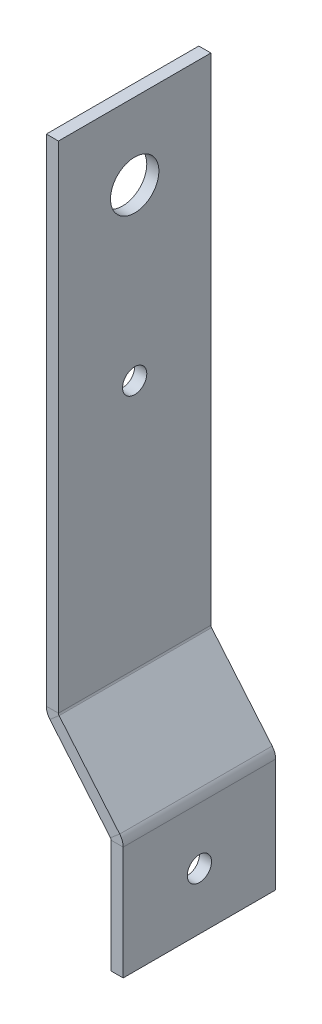
ISO-10303-21;
HEADER;
FILE_DESCRIPTION(('STEP AP214'),'2;1');
FILE_NAME('part.step','',(''),(''),'','','');
FILE_SCHEMA(('AUTOMOTIVE_DESIGN { 1 0 10303 214 1 1 1 1 }'));
ENDSEC;
DATA;
#1=APPLICATION_CONTEXT('core data for automotive mechanical design processes');
#2=APPLICATION_PROTOCOL_DEFINITION('international standard','automotive_design',2000,#1);
#3=PRODUCT_CONTEXT('',#1,'mechanical');
#4=PRODUCT('Part','Part','',(#3));
#5=PRODUCT_RELATED_PRODUCT_CATEGORY('part','',(#4));
#6=PRODUCT_DEFINITION_FORMATION('','',#4);
#7=PRODUCT_DEFINITION_CONTEXT('part definition',#1,'design');
#8=PRODUCT_DEFINITION('design','',#6,#7);
#9=PRODUCT_DEFINITION_SHAPE('','',#8);
#10=(LENGTH_UNIT() NAMED_UNIT(*) SI_UNIT(.MILLI.,.METRE.));
#11=(NAMED_UNIT(*) PLANE_ANGLE_UNIT() SI_UNIT($,.RADIAN.));
#12=(NAMED_UNIT(*) SI_UNIT($,.STERADIAN.) SOLID_ANGLE_UNIT());
#13=UNCERTAINTY_MEASURE_WITH_UNIT(LENGTH_MEASURE(1.E-05),#10,'distance_accuracy_value','');
#14=(GEOMETRIC_REPRESENTATION_CONTEXT(3) GLOBAL_UNCERTAINTY_ASSIGNED_CONTEXT((#13)) GLOBAL_UNIT_ASSIGNED_CONTEXT((#10,
#11,#12)) REPRESENTATION_CONTEXT('',''));
#15=CARTESIAN_POINT('',(0.,0.,0.));
#16=DIRECTION('',(0.,0.,1.));
#17=DIRECTION('',(1.,0.,0.));
#18=AXIS2_PLACEMENT_3D('',#15,#16,#17);
#19=CARTESIAN_POINT('',(-3.175,-130.,0.));
#20=DIRECTION('',(0.,0.,1.));
#21=DIRECTION('',(1.,0.,0.));
#22=AXIS2_PLACEMENT_3D('',#19,#20,#21);
#23=PLANE('',#22);
#24=DIRECTION('',(0.,-1.,0.));
#25=VECTOR('',#24,1.);
#26=CARTESIAN_POINT('',(0.,-130.,0.));
#27=LINE('',#26,#25);
#28=CARTESIAN_POINT('',(0.,0.,0.));
#29=VERTEX_POINT('',#28);
#30=CARTESIAN_POINT('',(0.,-130.,0.));
#31=VERTEX_POINT('',#30);
#32=EDGE_CURVE('E283',#29,#31,#27,.T.);
#33=ORIENTED_EDGE('',*,*,#32,.F.);
#34=DIRECTION('',(1.,0.,0.));
#35=VECTOR('',#34,1.);
#36=CARTESIAN_POINT('',(-3.175,0.,0.));
#37=LINE('',#36,#35);
#38=CARTESIAN_POINT('',(-3.175,0.,0.));
#39=VERTEX_POINT('',#38);
#40=EDGE_CURVE('E13',#39,#29,#37,.T.);
#41=ORIENTED_EDGE('',*,*,#40,.F.);
#42=DIRECTION('',(0.,-1.,0.));
#43=VECTOR('',#42,1.);
#44=CARTESIAN_POINT('',(-3.175,-130.,0.));
#45=LINE('',#44,#43);
#46=CARTESIAN_POINT('',(-3.175,-130.,0.));
#47=VERTEX_POINT('',#46);
#48=EDGE_CURVE('E286',#39,#47,#45,.T.);
#49=ORIENTED_EDGE('',*,*,#48,.T.);
#50=DIRECTION('',(1.,0.,0.));
#51=VECTOR('',#50,1.);
#52=CARTESIAN_POINT('',(-3.175,-130.,0.));
#53=LINE('',#52,#51);
#54=EDGE_CURVE('E85',#47,#31,#53,.T.);
#55=ORIENTED_EDGE('',*,*,#54,.T.);
#56=EDGE_LOOP('',(#33,#41,#49,#55));
#57=FACE_BOUND('',#56,.T.);
#58=ADVANCED_FACE('F82',(#57),#23,.T.);
#59=CARTESIAN_POINT('',(-3.175,0.,0.));
#60=DIRECTION('',(0.,1.,0.));
#61=DIRECTION('',(0.,0.,1.));
#62=AXIS2_PLACEMENT_3D('',#59,#60,#61);
#63=PLANE('',#62);
#64=DIRECTION('',(0.,0.,1.));
#65=VECTOR('',#64,1.);
#66=CARTESIAN_POINT('',(0.,0.,0.));
#67=LINE('',#66,#65);
#68=CARTESIAN_POINT('',(0.,0.,-40.));
#69=VERTEX_POINT('',#68);
#70=EDGE_CURVE('E288',#69,#29,#67,.T.);
#71=ORIENTED_EDGE('',*,*,#70,.F.);
#72=DIRECTION('',(1.,0.,0.));
#73=VECTOR('',#72,1.);
#74=CARTESIAN_POINT('',(-3.175,0.,-40.));
#75=LINE('',#74,#73);
#76=CARTESIAN_POINT('',(-3.175,0.,-40.));
#77=VERTEX_POINT('',#76);
#78=EDGE_CURVE('E91',#77,#69,#75,.T.);
#79=ORIENTED_EDGE('',*,*,#78,.F.);
#80=DIRECTION('',(0.,0.,1.));
#81=VECTOR('',#80,1.);
#82=CARTESIAN_POINT('',(-3.175,0.,0.));
#83=LINE('',#82,#81);
#84=EDGE_CURVE('E292',#77,#39,#83,.T.);
#85=ORIENTED_EDGE('',*,*,#84,.T.);
#86=ORIENTED_EDGE('',*,*,#40,.T.);
#87=EDGE_LOOP('',(#71,#79,#85,#86));
#88=FACE_BOUND('',#87,.T.);
#89=ADVANCED_FACE('F367',(#88),#63,.T.);
#90=CARTESIAN_POINT('',(-3.175,0.,-40.));
#91=DIRECTION('',(0.,0.,-1.));
#92=DIRECTION('',(0.,1.,0.));
#93=AXIS2_PLACEMENT_3D('',#90,#91,#92);
#94=PLANE('',#93);
#95=DIRECTION('',(0.,1.,0.));
#96=VECTOR('',#95,1.);
#97=CARTESIAN_POINT('',(0.,0.,-40.));
#98=LINE('',#97,#96);
#99=CARTESIAN_POINT('',(0.,-130.,-40.));
#100=VERTEX_POINT('',#99);
#101=EDGE_CURVE('E299',#100,#69,#98,.T.);
#102=ORIENTED_EDGE('',*,*,#101,.F.);
#103=DIRECTION('',(1.,0.,0.));
#104=VECTOR('',#103,1.);
#105=CARTESIAN_POINT('',(-3.175,-130.,-40.));
#106=LINE('',#105,#104);
#107=CARTESIAN_POINT('',(-3.175,-130.,-40.));
#108=VERTEX_POINT('',#107);
#109=EDGE_CURVE('E303',#108,#100,#106,.T.);
#110=ORIENTED_EDGE('',*,*,#109,.F.);
#111=DIRECTION('',(0.,1.,0.));
#112=VECTOR('',#111,1.);
#113=CARTESIAN_POINT('',(-3.175,0.,-40.));
#114=LINE('',#113,#112);
#115=EDGE_CURVE('E290',#108,#77,#114,.T.);
#116=ORIENTED_EDGE('',*,*,#115,.T.);
#117=ORIENTED_EDGE('',*,*,#78,.T.);
#118=EDGE_LOOP('',(#102,#110,#116,#117));
#119=FACE_BOUND('',#118,.T.);
#120=ADVANCED_FACE('F371',(#119),#94,.T.);
#121=CARTESIAN_POINT('',(-3.175,0.,0.));
#122=DIRECTION('',(-1.,0.,0.));
#123=DIRECTION('',(0.,0.,1.));
#124=AXIS2_PLACEMENT_3D('',#121,#122,#123);
#125=PLANE('',#124);
#126=CARTESIAN_POINT('',(-3.175,-64.45,-20.));
#127=DIRECTION('',(1.,0.,0.));
#128=DIRECTION('',(0.,0.,-1.));
#129=AXIS2_PLACEMENT_3D('',#126,#127,#128);
#130=CIRCLE('',#129,3.175);
#131=CARTESIAN_POINT('',(-3.175,-64.45,-23.175));
#132=VERTEX_POINT('',#131);
#133=EDGE_CURVE('E274',#132,#132,#130,.T.);
#134=ORIENTED_EDGE('',*,*,#133,.T.);
#135=EDGE_LOOP('',(#134));
#136=FACE_BOUND('',#135,.T.);
#137=CARTESIAN_POINT('',(-3.175,-20.,-20.));
#138=DIRECTION('',(1.,0.,0.));
#139=DIRECTION('',(0.,0.,-1.));
#140=AXIS2_PLACEMENT_3D('',#137,#138,#139);
#141=CIRCLE('',#140,6.35);
#142=CARTESIAN_POINT('',(-3.175,-20.,-26.35));
#143=VERTEX_POINT('',#142);
#144=EDGE_CURVE('E280',#143,#143,#141,.T.);
#145=ORIENTED_EDGE('',*,*,#144,.T.);
#146=EDGE_LOOP('',(#145));
#147=FACE_BOUND('',#146,.T.);
#148=ORIENTED_EDGE('',*,*,#48,.F.);
#149=ORIENTED_EDGE('',*,*,#84,.F.);
#150=ORIENTED_EDGE('',*,*,#115,.F.);
#151=DIRECTION('',(0.,0.,-1.));
#152=VECTOR('',#151,1.);
#153=CARTESIAN_POINT('',(-3.175,-130.,-40.));
#154=LINE('',#153,#152);
#155=EDGE_CURVE('E123',#47,#108,#154,.T.);
#156=ORIENTED_EDGE('',*,*,#155,.F.);
#157=EDGE_LOOP('',(#148,#149,#150,#156));
#158=FACE_BOUND('',#157,.T.);
#159=ADVANCED_FACE('F376',(#136,#147,#158),#125,.T.);
#160=CARTESIAN_POINT('',(0.,0.,0.));
#161=DIRECTION('',(-1.,0.,0.));
#162=DIRECTION('',(0.,0.,1.));
#163=AXIS2_PLACEMENT_3D('',#160,#161,#162);
#164=PLANE('',#163);
#165=CARTESIAN_POINT('',(0.,-64.45,-20.));
#166=DIRECTION('',(1.,0.,0.));
#167=DIRECTION('',(0.,0.,-1.));
#168=AXIS2_PLACEMENT_3D('',#165,#166,#167);
#169=CIRCLE('',#168,3.175);
#170=CARTESIAN_POINT('',(0.,-64.45,-23.175));
#171=VERTEX_POINT('',#170);
#172=EDGE_CURVE('E265',#171,#171,#169,.T.);
#173=ORIENTED_EDGE('',*,*,#172,.F.);
#174=EDGE_LOOP('',(#173));
#175=FACE_BOUND('',#174,.T.);
#176=CARTESIAN_POINT('',(0.,-20.,-20.));
#177=DIRECTION('',(1.,0.,0.));
#178=DIRECTION('',(0.,0.,-1.));
#179=AXIS2_PLACEMENT_3D('',#176,#177,#178);
#180=CIRCLE('',#179,6.35);
#181=CARTESIAN_POINT('',(0.,-20.,-26.35));
#182=VERTEX_POINT('',#181);
#183=EDGE_CURVE('E277',#182,#182,#180,.T.);
#184=ORIENTED_EDGE('',*,*,#183,.F.);
#185=EDGE_LOOP('',(#184));
#186=FACE_BOUND('',#185,.T.);
#187=ORIENTED_EDGE('',*,*,#32,.T.);
#188=DIRECTION('',(0.,0.,-1.));
#189=VECTOR('',#188,1.);
#190=CARTESIAN_POINT('',(0.,-130.,-40.));
#191=LINE('',#190,#189);
#192=EDGE_CURVE('E296',#31,#100,#191,.T.);
#193=ORIENTED_EDGE('',*,*,#192,.T.);
#194=ORIENTED_EDGE('',*,*,#101,.T.);
#195=ORIENTED_EDGE('',*,*,#70,.T.);
#196=EDGE_LOOP('',(#187,#193,#194,#195));
#197=FACE_BOUND('',#196,.T.);
#198=ADVANCED_FACE('F314',(#175,#186,#197),#164,.F.);
#199=CARTESIAN_POINT('',(-3.175,-20.,-20.));
#200=DIRECTION('',(1.,0.,0.));
#201=DIRECTION('',(0.,0.,-1.));
#202=AXIS2_PLACEMENT_3D('',#199,#200,#201);
#203=CYLINDRICAL_SURFACE('',#202,6.35);
#204=ORIENTED_EDGE('',*,*,#144,.F.);
#205=EDGE_LOOP('',(#204));
#206=FACE_BOUND('',#205,.T.);
#207=ORIENTED_EDGE('',*,*,#183,.T.);
#208=EDGE_LOOP('',(#207));
#209=FACE_BOUND('',#208,.T.);
#210=ADVANCED_FACE('F380',(#206,#209),#203,.F.);
#211=CARTESIAN_POINT('',(-3.175,-64.45,-20.));
#212=DIRECTION('',(1.,0.,0.));
#213=DIRECTION('',(0.,0.,-1.));
#214=AXIS2_PLACEMENT_3D('',#211,#212,#213);
#215=CYLINDRICAL_SURFACE('',#214,3.175);
#216=ORIENTED_EDGE('',*,*,#133,.F.);
#217=EDGE_LOOP('',(#216));
#218=FACE_BOUND('',#217,.T.);
#219=ORIENTED_EDGE('',*,*,#172,.T.);
#220=EDGE_LOOP('',(#219));
#221=FACE_BOUND('',#220,.T.);
#222=ADVANCED_FACE('F387',(#218,#221),#215,.F.);
#223=CARTESIAN_POINT('',(0.736600000000022,-130.,0.));
#224=DIRECTION('',(0.,0.,1.));
#225=DIRECTION('',(1.,0.,0.));
#226=AXIS2_PLACEMENT_3D('',#223,#224,#225);
#227=PLANE('',#226);
#228=DIRECTION('',(0.766044443118982,0.642787609686535,0.));
#229=VECTOR('',#228,1.);
#230=CARTESIAN_POINT('',(-2.2598594437042,-132.51432801405,0.));
#231=LINE('',#230,#229);
#232=CARTESIAN_POINT('',(0.172331663198561,-130.473477353295,0.));
#233=VERTEX_POINT('',#232);
#234=CARTESIAN_POINT('',(-2.25985944370421,-132.51432801405,0.));
#235=VERTEX_POINT('',#234);
#236=EDGE_CURVE('E221',#233,#235,#231,.F.);
#237=ORIENTED_EDGE('',*,*,#236,.F.);
#238=CARTESIAN_POINT('',(0.736600000000022,-130.,0.));
#239=DIRECTION('',(0.,0.,-1.));
#240=DIRECTION('',(-1.,0.,0.));
#241=AXIS2_PLACEMENT_3D('',#238,#239,#240);
#242=CIRCLE('',#241,0.736600000000025);
#243=EDGE_CURVE('E269',#31,#233,#242,.F.);
#244=ORIENTED_EDGE('',*,*,#243,.F.);
#245=ORIENTED_EDGE('',*,*,#54,.F.);
#246=CARTESIAN_POINT('',(0.736600000000022,-130.,0.));
#247=DIRECTION('',(0.,0.,-1.));
#248=DIRECTION('',(-1.,0.,0.));
#249=AXIS2_PLACEMENT_3D('',#246,#247,#248);
#250=CIRCLE('',#249,3.91160000000002);
#251=EDGE_CURVE('E262',#47,#235,#250,.F.);
#252=ORIENTED_EDGE('',*,*,#251,.T.);
#253=EDGE_LOOP('',(#237,#244,#245,#252));
#254=FACE_BOUND('',#253,.T.);
#255=ADVANCED_FACE('F318',(#254),#227,.T.);
#256=CARTESIAN_POINT('',(0.736600000000022,-130.,-40.));
#257=DIRECTION('',(0.,0.,1.));
#258=DIRECTION('',(1.,0.,0.));
#259=AXIS2_PLACEMENT_3D('',#256,#257,#258);
#260=PLANE('',#259);
#261=CARTESIAN_POINT('',(0.736600000000022,-130.,-40.));
#262=DIRECTION('',(0.,0.,-1.));
#263=DIRECTION('',(-1.,0.,0.));
#264=AXIS2_PLACEMENT_3D('',#261,#262,#263);
#265=CIRCLE('',#264,0.736600000000025);
#266=CARTESIAN_POINT('',(0.172331663198561,-130.473477353295,-40.));
#267=VERTEX_POINT('',#266);
#268=EDGE_CURVE('E234',#267,#100,#265,.T.);
#269=ORIENTED_EDGE('',*,*,#268,.F.);
#270=DIRECTION('',(0.766044443118982,0.642787609686535,0.));
#271=VECTOR('',#270,1.);
#272=CARTESIAN_POINT('',(0.172331663198563,-130.473477353295,-40.));
#273=LINE('',#272,#271);
#274=CARTESIAN_POINT('',(-2.2598594437042,-132.51432801405,-40.));
#275=VERTEX_POINT('',#274);
#276=EDGE_CURVE('E255',#267,#275,#273,.F.);
#277=ORIENTED_EDGE('',*,*,#276,.T.);
#278=CARTESIAN_POINT('',(0.736600000000022,-130.,-40.));
#279=DIRECTION('',(0.,0.,-1.));
#280=DIRECTION('',(-1.,0.,0.));
#281=AXIS2_PLACEMENT_3D('',#278,#279,#280);
#282=CIRCLE('',#281,3.91160000000002);
#283=EDGE_CURVE('E266',#275,#108,#282,.T.);
#284=ORIENTED_EDGE('',*,*,#283,.T.);
#285=ORIENTED_EDGE('',*,*,#109,.T.);
#286=EDGE_LOOP('',(#269,#277,#284,#285));
#287=FACE_BOUND('',#286,.T.);
#288=ADVANCED_FACE('F392',(#287),#260,.F.);
#289=CARTESIAN_POINT('',(0.736600000000022,-130.,-40.));
#290=DIRECTION('',(0.,0.,-1.));
#291=DIRECTION('',(-0.766044443118982,-0.642787609686535,0.));
#292=AXIS2_PLACEMENT_3D('',#289,#290,#291);
#293=CYLINDRICAL_SURFACE('',#292,3.91160000000002);
#294=ORIENTED_EDGE('',*,*,#155,.T.);
#295=ORIENTED_EDGE('',*,*,#283,.F.);
#296=DIRECTION('',(0.,0.,-1.));
#297=VECTOR('',#296,1.);
#298=CARTESIAN_POINT('',(-2.2598594437042,-132.51432801405,0.));
#299=LINE('',#298,#297);
#300=EDGE_CURVE('E253',#275,#235,#299,.F.);
#301=ORIENTED_EDGE('',*,*,#300,.T.);
#302=ORIENTED_EDGE('',*,*,#251,.F.);
#303=EDGE_LOOP('',(#294,#295,#301,#302));
#304=FACE_BOUND('',#303,.T.);
#305=ADVANCED_FACE('F395',(#304),#293,.T.);
#306=CARTESIAN_POINT('',(0.736600000000022,-130.,-40.));
#307=DIRECTION('',(0.,0.,-1.));
#308=DIRECTION('',(-0.766044443118982,-0.642787609686535,0.));
#309=AXIS2_PLACEMENT_3D('',#306,#307,#308);
#310=CYLINDRICAL_SURFACE('',#309,0.736600000000025);
#311=ORIENTED_EDGE('',*,*,#192,.F.);
#312=ORIENTED_EDGE('',*,*,#243,.T.);
#313=DIRECTION('',(0.,0.,-1.));
#314=VECTOR('',#313,1.);
#315=CARTESIAN_POINT('',(0.172331663198563,-130.473477353295,0.));
#316=LINE('',#315,#314);
#317=EDGE_CURVE('E258',#233,#267,#316,.T.);
#318=ORIENTED_EDGE('',*,*,#317,.T.);
#319=ORIENTED_EDGE('',*,*,#268,.T.);
#320=EDGE_LOOP('',(#311,#312,#318,#319));
#321=FACE_BOUND('',#320,.T.);
#322=ADVANCED_FACE('F316',(#321),#310,.F.);
#323=CARTESIAN_POINT('',(13.6374991352606,-151.46006221329,-40.));
#324=DIRECTION('',(0.,0.,1.));
#325=DIRECTION('',(0.,-1.,0.));
#326=AXIS2_PLACEMENT_3D('',#323,#324,#325);
#327=PLANE('',#326);
#328=ORIENTED_EDGE('',*,*,#276,.F.);
#329=DIRECTION('',(-0.642787609686535,0.766044443118982,0.));
#330=VECTOR('',#329,1.);
#331=CARTESIAN_POINT('',(16.0696902421634,-149.419211552535,-40.));
#332=LINE('',#331,#330);
#333=CARTESIAN_POINT('',(16.0696902421634,-149.419211552535,-40.));
#334=VERTEX_POINT('',#333);
#335=EDGE_CURVE('E251',#267,#334,#332,.F.);
#336=ORIENTED_EDGE('',*,*,#335,.T.);
#337=DIRECTION('',(0.766044443118982,0.642787609686535,0.));
#338=VECTOR('',#337,1.);
#339=CARTESIAN_POINT('',(13.6374991352606,-151.46006221329,-40.));
#340=LINE('',#339,#338);
#341=CARTESIAN_POINT('',(13.6374991352606,-151.46006221329,-40.));
#342=VERTEX_POINT('',#341);
#343=EDGE_CURVE('E231',#342,#334,#340,.T.);
#344=ORIENTED_EDGE('',*,*,#343,.F.);
#345=DIRECTION('',(0.642787609686535,-0.766044443118982,0.));
#346=VECTOR('',#345,1.);
#347=CARTESIAN_POINT('',(-66.4446950526961,-56.0218195869641,-40.0000000000001));
#348=LINE('',#347,#346);
#349=EDGE_CURVE('E243',#275,#342,#348,.T.);
#350=ORIENTED_EDGE('',*,*,#349,.F.);
#351=EDGE_LOOP('',(#328,#336,#344,#350));
#352=FACE_BOUND('',#351,.T.);
#353=ADVANCED_FACE('F400',(#352),#327,.F.);
#354=CARTESIAN_POINT('',(-2.43219110690277,-132.308951135315,0.));
#355=DIRECTION('',(0.,0.,-1.));
#356=DIRECTION('',(0.,1.,0.));
#357=AXIS2_PLACEMENT_3D('',#354,#355,#356);
#358=PLANE('',#357);
#359=ORIENTED_EDGE('',*,*,#236,.T.);
#360=DIRECTION('',(-0.642787609686535,0.766044443118982,0.));
#361=VECTOR('',#360,1.);
#362=CARTESIAN_POINT('',(-66.4446950526962,-56.021819586964,0.));
#363=LINE('',#362,#361);
#364=CARTESIAN_POINT('',(13.6374991352606,-151.46006221329,0.));
#365=VERTEX_POINT('',#364);
#366=EDGE_CURVE('E238',#365,#235,#363,.T.);
#367=ORIENTED_EDGE('',*,*,#366,.F.);
#368=DIRECTION('',(0.766044443118982,0.642787609686535,0.));
#369=VECTOR('',#368,1.);
#370=CARTESIAN_POINT('',(13.6374991352606,-151.46006221329,0.));
#371=LINE('',#370,#369);
#372=CARTESIAN_POINT('',(16.0696902421634,-149.419211552535,0.));
#373=VERTEX_POINT('',#372);
#374=EDGE_CURVE('E235',#365,#373,#371,.T.);
#375=ORIENTED_EDGE('',*,*,#374,.T.);
#376=DIRECTION('',(0.642787609686535,-0.766044443118982,0.));
#377=VECTOR('',#376,1.);
#378=CARTESIAN_POINT('',(0.,-130.26810047456,0.));
#379=LINE('',#378,#377);
#380=EDGE_CURVE('E245',#373,#233,#379,.F.);
#381=ORIENTED_EDGE('',*,*,#380,.T.);
#382=EDGE_LOOP('',(#359,#367,#375,#381));
#383=FACE_BOUND('',#382,.T.);
#384=ADVANCED_FACE('F321',(#383),#358,.F.);
#385=CARTESIAN_POINT('',(-66.4446950526962,-56.021819586964,0.));
#386=DIRECTION('',(0.766044443118982,0.642787609686535,0.));
#387=DIRECTION('',(-0.642787609686535,0.766044443118982,0.));
#388=AXIS2_PLACEMENT_3D('',#385,#386,#387);
#389=PLANE('',#388);
#390=ORIENTED_EDGE('',*,*,#300,.F.);
#391=ORIENTED_EDGE('',*,*,#349,.T.);
#392=DIRECTION('',(0.,0.,1.));
#393=VECTOR('',#392,1.);
#394=CARTESIAN_POINT('',(13.6374991352606,-151.46006221329,0.));
#395=LINE('',#394,#393);
#396=EDGE_CURVE('E241',#342,#365,#395,.T.);
#397=ORIENTED_EDGE('',*,*,#396,.T.);
#398=ORIENTED_EDGE('',*,*,#366,.T.);
#399=EDGE_LOOP('',(#390,#391,#397,#398));
#400=FACE_BOUND('',#399,.T.);
#401=ADVANCED_FACE('F325',(#400),#389,.F.);
#402=CARTESIAN_POINT('',(-64.0125039457934,-53.9809689262093,0.));
#403=DIRECTION('',(0.766044443118982,0.642787609686535,0.));
#404=DIRECTION('',(-0.642787609686535,0.766044443118982,0.));
#405=AXIS2_PLACEMENT_3D('',#402,#403,#404);
#406=PLANE('',#405);
#407=ORIENTED_EDGE('',*,*,#335,.F.);
#408=ORIENTED_EDGE('',*,*,#317,.F.);
#409=ORIENTED_EDGE('',*,*,#380,.F.);
#410=DIRECTION('',(0.,0.,-1.));
#411=VECTOR('',#410,1.);
#412=CARTESIAN_POINT('',(16.0696902421634,-149.419211552535,0.));
#413=LINE('',#412,#411);
#414=EDGE_CURVE('E248',#334,#373,#413,.F.);
#415=ORIENTED_EDGE('',*,*,#414,.F.);
#416=EDGE_LOOP('',(#407,#408,#409,#415));
#417=FACE_BOUND('',#416,.T.);
#418=ADVANCED_FACE('F409',(#417),#406,.T.);
#419=CARTESIAN_POINT('',(13.0732307984592,-151.933539566585,-40.));
#420=DIRECTION('',(0.,0.,-1.));
#421=DIRECTION('',(-1.,0.,0.));
#422=AXIS2_PLACEMENT_3D('',#419,#420,#421);
#423=PLANE('',#422);
#424=DIRECTION('',(-1.,0.,0.));
#425=VECTOR('',#424,1.);
#426=CARTESIAN_POINT('',(16.9848307984592,-151.933539566585,-40.));
#427=LINE('',#426,#425);
#428=CARTESIAN_POINT('',(13.8098307984592,-151.933539566585,-40.));
#429=VERTEX_POINT('',#428);
#430=CARTESIAN_POINT('',(16.9848307984592,-151.933539566585,-40.));
#431=VERTEX_POINT('',#430);
#432=EDGE_CURVE('E200',#429,#431,#427,.F.);
#433=ORIENTED_EDGE('',*,*,#432,.F.);
#434=CARTESIAN_POINT('',(13.0732307984592,-151.933539566585,-40.));
#435=DIRECTION('',(0.,0.,1.));
#436=DIRECTION('',(1.,0.,0.));
#437=AXIS2_PLACEMENT_3D('',#434,#435,#436);
#438=CIRCLE('',#437,0.736600000000016);
#439=EDGE_CURVE('E225',#342,#429,#438,.F.);
#440=ORIENTED_EDGE('',*,*,#439,.F.);
#441=ORIENTED_EDGE('',*,*,#343,.T.);
#442=CARTESIAN_POINT('',(13.0732307984592,-151.933539566585,-40.));
#443=DIRECTION('',(0.,0.,1.));
#444=DIRECTION('',(1.,0.,0.));
#445=AXIS2_PLACEMENT_3D('',#442,#443,#444);
#446=CIRCLE('',#445,3.91160000000002);
#447=EDGE_CURVE('E218',#334,#431,#446,.F.);
#448=ORIENTED_EDGE('',*,*,#447,.T.);
#449=EDGE_LOOP('',(#433,#440,#441,#448));
#450=FACE_BOUND('',#449,.T.);
#451=ADVANCED_FACE('F335',(#450),#423,.T.);
#452=CARTESIAN_POINT('',(13.0732307984592,-151.933539566585,0.));
#453=DIRECTION('',(0.,0.,-1.));
#454=DIRECTION('',(-1.,0.,0.));
#455=AXIS2_PLACEMENT_3D('',#452,#453,#454);
#456=PLANE('',#455);
#457=CARTESIAN_POINT('',(13.0732307984592,-151.933539566585,0.));
#458=DIRECTION('',(0.,0.,1.));
#459=DIRECTION('',(1.,0.,0.));
#460=AXIS2_PLACEMENT_3D('',#457,#458,#459);
#461=CIRCLE('',#460,0.736600000000016);
#462=CARTESIAN_POINT('',(13.8098307984592,-151.933539566585,0.));
#463=VERTEX_POINT('',#462);
#464=EDGE_CURVE('E228',#463,#365,#461,.T.);
#465=ORIENTED_EDGE('',*,*,#464,.F.);
#466=DIRECTION('',(-1.,0.,0.));
#467=VECTOR('',#466,1.);
#468=CARTESIAN_POINT('',(13.8098307984592,-151.933539566585,0.));
#469=LINE('',#468,#467);
#470=CARTESIAN_POINT('',(16.9848307984592,-151.933539566585,0.));
#471=VERTEX_POINT('',#470);
#472=EDGE_CURVE('E211',#463,#471,#469,.F.);
#473=ORIENTED_EDGE('',*,*,#472,.T.);
#474=CARTESIAN_POINT('',(13.0732307984592,-151.933539566585,0.));
#475=DIRECTION('',(0.,0.,1.));
#476=DIRECTION('',(1.,0.,0.));
#477=AXIS2_PLACEMENT_3D('',#474,#475,#476);
#478=CIRCLE('',#477,3.91160000000002);
#479=EDGE_CURVE('E222',#471,#373,#478,.T.);
#480=ORIENTED_EDGE('',*,*,#479,.T.);
#481=ORIENTED_EDGE('',*,*,#374,.F.);
#482=EDGE_LOOP('',(#465,#473,#480,#481));
#483=FACE_BOUND('',#482,.T.);
#484=ADVANCED_FACE('F415',(#483),#456,.F.);
#485=CARTESIAN_POINT('',(13.0732307984592,-151.933539566585,0.));
#486=DIRECTION('',(0.,0.,1.));
#487=DIRECTION('',(1.,0.,0.));
#488=AXIS2_PLACEMENT_3D('',#485,#486,#487);
#489=CYLINDRICAL_SURFACE('',#488,3.91160000000002);
#490=ORIENTED_EDGE('',*,*,#414,.T.);
#491=ORIENTED_EDGE('',*,*,#479,.F.);
#492=DIRECTION('',(0.,0.,1.));
#493=VECTOR('',#492,1.);
#494=CARTESIAN_POINT('',(16.9848307984592,-151.933539566585,-40.));
#495=LINE('',#494,#493);
#496=EDGE_CURVE('E209',#471,#431,#495,.F.);
#497=ORIENTED_EDGE('',*,*,#496,.T.);
#498=ORIENTED_EDGE('',*,*,#447,.F.);
#499=EDGE_LOOP('',(#490,#491,#497,#498));
#500=FACE_BOUND('',#499,.T.);
#501=ADVANCED_FACE('F338',(#500),#489,.T.);
#502=CARTESIAN_POINT('',(13.0732307984592,-151.933539566585,0.));
#503=DIRECTION('',(0.,0.,1.));
#504=DIRECTION('',(1.,0.,0.));
#505=AXIS2_PLACEMENT_3D('',#502,#503,#504);
#506=CYLINDRICAL_SURFACE('',#505,0.736600000000016);
#507=ORIENTED_EDGE('',*,*,#396,.F.);
#508=ORIENTED_EDGE('',*,*,#439,.T.);
#509=DIRECTION('',(0.,0.,1.));
#510=VECTOR('',#509,1.);
#511=CARTESIAN_POINT('',(13.8098307984592,-151.933539566585,-40.));
#512=LINE('',#511,#510);
#513=EDGE_CURVE('E214',#429,#463,#512,.T.);
#514=ORIENTED_EDGE('',*,*,#513,.T.);
#515=ORIENTED_EDGE('',*,*,#464,.T.);
#516=EDGE_LOOP('',(#507,#508,#514,#515));
#517=FACE_BOUND('',#516,.T.);
#518=ADVANCED_FACE('F331',(#517),#506,.F.);
#519=CARTESIAN_POINT('',(16.9848307984592,-151.665439092024,-40.));
#520=DIRECTION('',(0.,0.,1.));
#521=DIRECTION('',(1.,0.,0.));
#522=AXIS2_PLACEMENT_3D('',#519,#520,#521);
#523=PLANE('',#522);
#524=ORIENTED_EDGE('',*,*,#432,.T.);
#525=DIRECTION('',(0.,1.,0.));
#526=VECTOR('',#525,1.);
#527=CARTESIAN_POINT('',(16.9848307984592,-0.205376878734619,-40.));
#528=LINE('',#527,#526);
#529=CARTESIAN_POINT('',(16.9848307984592,-181.665439092024,-40.));
#530=VERTEX_POINT('',#529);
#531=EDGE_CURVE('E181',#530,#431,#528,.T.);
#532=ORIENTED_EDGE('',*,*,#531,.F.);
#533=DIRECTION('',(-1.,0.,0.));
#534=VECTOR('',#533,1.);
#535=CARTESIAN_POINT('',(16.9848307984592,-181.665439092024,-40.));
#536=LINE('',#535,#534);
#537=CARTESIAN_POINT('',(13.8098307984592,-181.665439092024,-40.));
#538=VERTEX_POINT('',#537);
#539=EDGE_CURVE('E187',#530,#538,#536,.T.);
#540=ORIENTED_EDGE('',*,*,#539,.T.);
#541=DIRECTION('',(0.,-1.,0.));
#542=VECTOR('',#541,1.);
#543=CARTESIAN_POINT('',(13.8098307984592,-151.665439092024,-40.));
#544=LINE('',#543,#542);
#545=EDGE_CURVE('E207',#538,#429,#544,.F.);
#546=ORIENTED_EDGE('',*,*,#545,.T.);
#547=EDGE_LOOP('',(#524,#532,#540,#546));
#548=FACE_BOUND('',#547,.T.);
#549=ADVANCED_FACE('F199',(#548),#523,.F.);
#550=CARTESIAN_POINT('',(16.9848307984592,-181.665439092024,0.));
#551=DIRECTION('',(0.,0.,-1.));
#552=DIRECTION('',(0.,1.,0.));
#553=AXIS2_PLACEMENT_3D('',#550,#551,#552);
#554=PLANE('',#553);
#555=ORIENTED_EDGE('',*,*,#472,.F.);
#556=DIRECTION('',(0.,1.,0.));
#557=VECTOR('',#556,1.);
#558=CARTESIAN_POINT('',(13.8098307984592,-181.665439092024,0.));
#559=LINE('',#558,#557);
#560=CARTESIAN_POINT('',(13.8098307984592,-181.665439092024,0.));
#561=VERTEX_POINT('',#560);
#562=EDGE_CURVE('E203',#463,#561,#559,.F.);
#563=ORIENTED_EDGE('',*,*,#562,.T.);
#564=DIRECTION('',(-1.,0.,0.));
#565=VECTOR('',#564,1.);
#566=CARTESIAN_POINT('',(16.9848307984592,-181.665439092024,0.));
#567=LINE('',#566,#565);
#568=CARTESIAN_POINT('',(16.9848307984592,-181.665439092024,0.));
#569=VERTEX_POINT('',#568);
#570=EDGE_CURVE('E196',#569,#561,#567,.T.);
#571=ORIENTED_EDGE('',*,*,#570,.F.);
#572=DIRECTION('',(0.,-1.,0.));
#573=VECTOR('',#572,1.);
#574=CARTESIAN_POINT('',(16.9848307984592,-0.205376878734619,0.));
#575=LINE('',#574,#573);
#576=EDGE_CURVE('E183',#471,#569,#575,.T.);
#577=ORIENTED_EDGE('',*,*,#576,.F.);
#578=EDGE_LOOP('',(#555,#563,#571,#577));
#579=FACE_BOUND('',#578,.T.);
#580=ADVANCED_FACE('F342',(#579),#554,.F.);
#581=CARTESIAN_POINT('',(16.9848307984592,-0.205376878734619,0.));
#582=DIRECTION('',(-1.,0.,0.));
#583=DIRECTION('',(0.,0.,1.));
#584=AXIS2_PLACEMENT_3D('',#581,#582,#583);
#585=PLANE('',#584);
#586=CARTESIAN_POINT('',(16.9848307984593,-166.799489329305,-20.));
#587=DIRECTION('',(1.,0.,0.));
#588=DIRECTION('',(0.,1.,0.));
#589=AXIS2_PLACEMENT_3D('',#586,#587,#588);
#590=CIRCLE('',#589,3.175);
#591=CARTESIAN_POINT('',(16.9848307984593,-163.624489329305,-20.));
#592=VERTEX_POINT('',#591);
#593=EDGE_CURVE('E348',#592,#592,#590,.T.);
#594=ORIENTED_EDGE('',*,*,#593,.F.);
#595=EDGE_LOOP('',(#594));
#596=FACE_BOUND('',#595,.T.);
#597=ORIENTED_EDGE('',*,*,#496,.F.);
#598=ORIENTED_EDGE('',*,*,#576,.T.);
#599=DIRECTION('',(0.,0.,-1.));
#600=VECTOR('',#599,1.);
#601=CARTESIAN_POINT('',(16.9848307984592,-181.665439092024,0.));
#602=LINE('',#601,#600);
#603=EDGE_CURVE('E176',#569,#530,#602,.T.);
#604=ORIENTED_EDGE('',*,*,#603,.T.);
#605=ORIENTED_EDGE('',*,*,#531,.T.);
#606=EDGE_LOOP('',(#597,#598,#604,#605));
#607=FACE_BOUND('',#606,.T.);
#608=ADVANCED_FACE('F179',(#596,#607),#585,.F.);
#609=CARTESIAN_POINT('',(13.8098307984592,-0.205376878734619,0.));
#610=DIRECTION('',(-1.,0.,0.));
#611=DIRECTION('',(0.,0.,1.));
#612=AXIS2_PLACEMENT_3D('',#609,#610,#611);
#613=PLANE('',#612);
#614=CARTESIAN_POINT('',(13.8098307984592,-166.799489329305,-20.));
#615=DIRECTION('',(-1.,0.,0.));
#616=DIRECTION('',(0.,0.,1.));
#617=AXIS2_PLACEMENT_3D('',#614,#615,#616);
#618=CIRCLE('',#617,3.175);
#619=CARTESIAN_POINT('',(13.8098307984592,-166.799489329305,-16.825));
#620=VERTEX_POINT('',#619);
#621=EDGE_CURVE('E217',#620,#620,#618,.F.);
#622=ORIENTED_EDGE('',*,*,#621,.T.);
#623=EDGE_LOOP('',(#622));
#624=FACE_BOUND('',#623,.T.);
#625=ORIENTED_EDGE('',*,*,#562,.F.);
#626=ORIENTED_EDGE('',*,*,#513,.F.);
#627=ORIENTED_EDGE('',*,*,#545,.F.);
#628=DIRECTION('',(0.,0.,1.));
#629=VECTOR('',#628,1.);
#630=CARTESIAN_POINT('',(13.8098307984592,-181.665439092024,-40.));
#631=LINE('',#630,#629);
#632=EDGE_CURVE('E192',#561,#538,#631,.F.);
#633=ORIENTED_EDGE('',*,*,#632,.F.);
#634=EDGE_LOOP('',(#625,#626,#627,#633));
#635=FACE_BOUND('',#634,.T.);
#636=ADVANCED_FACE('F356',(#624,#635),#613,.T.);
#637=CARTESIAN_POINT('',(16.9848307984592,-181.665439092024,-40.));
#638=DIRECTION('',(0.,1.,0.));
#639=DIRECTION('',(0.,0.,1.));
#640=AXIS2_PLACEMENT_3D('',#637,#638,#639);
#641=PLANE('',#640);
#642=ORIENTED_EDGE('',*,*,#632,.T.);
#643=ORIENTED_EDGE('',*,*,#539,.F.);
#644=ORIENTED_EDGE('',*,*,#603,.F.);
#645=ORIENTED_EDGE('',*,*,#570,.T.);
#646=EDGE_LOOP('',(#642,#643,#644,#645));
#647=FACE_BOUND('',#646,.T.);
#648=ADVANCED_FACE('F190',(#647),#641,.F.);
#649=CARTESIAN_POINT('',(4.82957467739005,-166.799489329305,-20.));
#650=DIRECTION('',(1.,0.,0.));
#651=DIRECTION('',(0.,1.,0.));
#652=AXIS2_PLACEMENT_3D('',#649,#650,#651);
#653=CYLINDRICAL_SURFACE('',#652,3.175);
#654=ORIENTED_EDGE('',*,*,#593,.T.);
#655=EDGE_LOOP('',(#654));
#656=FACE_BOUND('',#655,.T.);
#657=ORIENTED_EDGE('',*,*,#621,.F.);
#658=EDGE_LOOP('',(#657));
#659=FACE_BOUND('',#658,.T.);
#660=ADVANCED_FACE('F352',(#656,#659),#653,.F.);
#661=CLOSED_SHELL('',(#58,#89,#120,#159,#198,#210,#222,#255,#288,#305,#322,#353,#384,#401,#418,
#451,#484,#501,#518,#549,#580,#608,#636,#648,#660));
#662=MANIFOLD_SOLID_BREP('B2',#661);
#663=ADVANCED_BREP_SHAPE_REPRESENTATION('',(#18,#662),#14);
#664=SHAPE_DEFINITION_REPRESENTATION(#9,#663);
ENDSEC;
END-ISO-10303-21;
